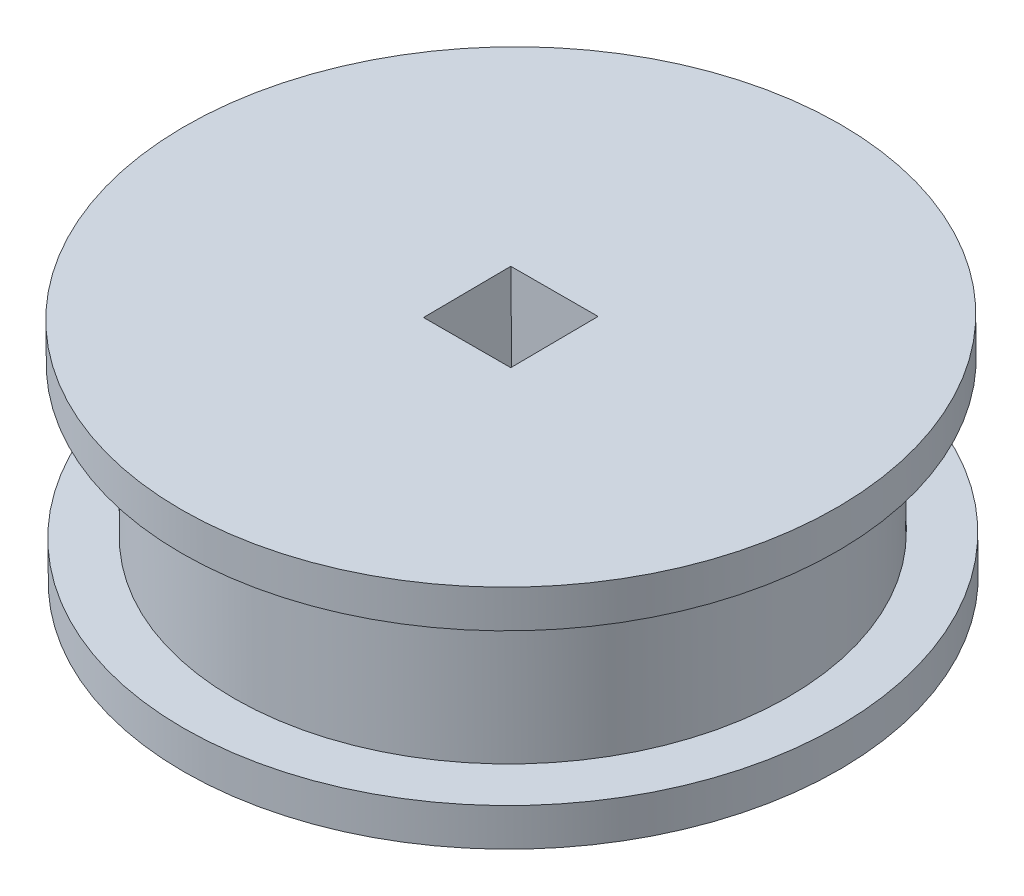
ISO-10303-21;
HEADER;
FILE_DESCRIPTION(('STEP AP214'),'2;1');
FILE_NAME('part.step','',(''),(''),'','','');
FILE_SCHEMA(('AUTOMOTIVE_DESIGN { 1 0 10303 214 1 1 1 1 }'));
ENDSEC;
DATA;
#1=APPLICATION_CONTEXT('core data for automotive mechanical design processes');
#2=APPLICATION_PROTOCOL_DEFINITION('international standard','automotive_design',2000,#1);
#3=PRODUCT_CONTEXT('',#1,'mechanical');
#4=PRODUCT('Part','Part','',(#3));
#5=PRODUCT_RELATED_PRODUCT_CATEGORY('part','',(#4));
#6=PRODUCT_DEFINITION_FORMATION('','',#4);
#7=PRODUCT_DEFINITION_CONTEXT('part definition',#1,'design');
#8=PRODUCT_DEFINITION('design','',#6,#7);
#9=PRODUCT_DEFINITION_SHAPE('','',#8);
#10=(LENGTH_UNIT() NAMED_UNIT(*) SI_UNIT(.MILLI.,.METRE.));
#11=(NAMED_UNIT(*) PLANE_ANGLE_UNIT() SI_UNIT($,.RADIAN.));
#12=(NAMED_UNIT(*) SI_UNIT($,.STERADIAN.) SOLID_ANGLE_UNIT());
#13=UNCERTAINTY_MEASURE_WITH_UNIT(LENGTH_MEASURE(1.E-05),#10,'distance_accuracy_value','');
#14=(GEOMETRIC_REPRESENTATION_CONTEXT(3) GLOBAL_UNCERTAINTY_ASSIGNED_CONTEXT((#13)) GLOBAL_UNIT_ASSIGNED_CONTEXT((#10,
#11,#12)) REPRESENTATION_CONTEXT('',''));
#15=CARTESIAN_POINT('',(0.,0.,0.));
#16=DIRECTION('',(0.,0.,1.));
#17=DIRECTION('',(1.,0.,0.));
#18=AXIS2_PLACEMENT_3D('',#15,#16,#17);
#19=CARTESIAN_POINT('',(-0.0188341703012513,8.85642782679297,-1.52504104998017));
#20=DIRECTION('',(0.00212652928721231,-0.999961923064171,-0.0084634682604122));
#21=DIRECTION('',(0.,0.00846348739691547,-0.99996418404915));
#22=AXIS2_PLACEMENT_3D('',#19,#20,#21);
#23=CYLINDRICAL_SURFACE('',#22,11.);
#24=CARTESIAN_POINT('',(-0.0188341703012513,8.85642782679297,-1.52504104998017));
#25=DIRECTION('',(-0.00212652928721231,0.999961923064171,0.00846346826041221));
#26=DIRECTION('',(0.,-0.00846348739691547,0.99996418404915));
#27=AXIS2_PLACEMENT_3D('',#24,#25,#26);
#28=CIRCLE('',#27,11.);
#29=CARTESIAN_POINT('',(-0.0188341703012513,8.7633294654269,9.47456497456048));
#30=VERTEX_POINT('',#29);
#31=EDGE_CURVE('E11',#30,#30,#28,.T.);
#32=ORIENTED_EDGE('',*,*,#31,.F.);
#33=EDGE_LOOP('',(#32));
#34=FACE_BOUND('',#33,.T.);
#35=CARTESIAN_POINT('',(-0.00607499457797741,2.85665628840794,-1.57582185954264));
#36=DIRECTION('',(-0.00212652928721231,0.999961923064171,0.00846346826041221));
#37=DIRECTION('',(0.,-0.00846348739691547,0.99996418404915));
#38=AXIS2_PLACEMENT_3D('',#35,#36,#37);
#39=CIRCLE('',#38,11.);
#40=CARTESIAN_POINT('',(-0.00607499457797741,2.76355792704187,9.42378416499801));
#41=VERTEX_POINT('',#40);
#42=EDGE_CURVE('E45',#41,#41,#39,.T.);
#43=ORIENTED_EDGE('',*,*,#42,.T.);
#44=EDGE_LOOP('',(#43));
#45=FACE_BOUND('',#44,.T.);
#46=ADVANCED_FACE('F39',(#34,#45),#23,.T.);
#47=CARTESIAN_POINT('',(-0.0188341703012513,8.85642782679297,-1.52504104998017));
#48=DIRECTION('',(-0.00212652928721231,0.999961923064171,0.00846346826041221));
#49=DIRECTION('',(0.,-0.00846348739691547,0.99996418404915));
#50=AXIS2_PLACEMENT_3D('',#47,#48,#49);
#51=PLANE('',#50);
#52=ORIENTED_EDGE('',*,*,#31,.T.);
#53=EDGE_LOOP('',(#52));
#54=FACE_BOUND('',#53,.T.);
#55=CARTESIAN_POINT('',(-0.0188341703012513,8.85642782679297,-1.52504104998017));
#56=DIRECTION('',(-0.00212652928721231,0.999961923064171,0.00846346826041221));
#57=DIRECTION('',(0.,-0.00846348739691547,0.99996418404915));
#58=AXIS2_PLACEMENT_3D('',#55,#56,#57);
#59=CIRCLE('',#58,13.);
#60=CARTESIAN_POINT('',(-0.0188341703012513,8.74640249063307,11.4744933426588));
#61=VERTEX_POINT('',#60);
#62=EDGE_CURVE('E120',#61,#61,#59,.T.);
#63=ORIENTED_EDGE('',*,*,#62,.F.);
#64=EDGE_LOOP('',(#63));
#65=FACE_BOUND('',#64,.T.);
#66=ADVANCED_FACE('F150',(#54,#65),#51,.F.);
#67=CARTESIAN_POINT('',(-0.0220239642320697,10.3563707113892,-1.51234584758955));
#68=DIRECTION('',(-0.00212652928721231,0.999961923064171,0.00846346826041221));
#69=DIRECTION('',(0.,-0.00846348739691547,0.99996418404915));
#70=AXIS2_PLACEMENT_3D('',#67,#68,#69);
#71=PLANE('',#70);
#72=DIRECTION('',(0.,-0.00846348739691562,0.99996418404915));
#73=VECTOR('',#72,1.);
#74=CARTESIAN_POINT('',(-1.74702006389329,10.3673020955108,-3.23731511137218));
#75=LINE('',#74,#73);
#76=CARTESIAN_POINT('',(-1.74702006389329,10.3673020955108,-3.23731511137218));
#77=VERTEX_POINT('',#76);
#78=CARTESIAN_POINT('',(-1.74702006389329,10.3381030639914,0.212561323597393));
#79=VERTEX_POINT('',#78);
#80=EDGE_CURVE('E89',#77,#79,#75,.T.);
#81=ORIENTED_EDGE('',*,*,#80,.F.);
#82=DIRECTION('',(-0.999997738934039,-0.00212645312354366,-1.79978538213382E-05));
#83=VECTOR('',#82,1.);
#84=CARTESIAN_POINT('',(1.70297213542915,10.374638358787,-3.23725301877649));
#85=LINE('',#84,#83);
#86=CARTESIAN_POINT('',(1.70297213542915,10.374638358787,-3.23725301877649));
#87=VERTEX_POINT('',#86);
#88=EDGE_CURVE('E92',#87,#77,#85,.T.);
#89=ORIENTED_EDGE('',*,*,#88,.F.);
#90=DIRECTION('',(0.,0.00846348739691512,-0.99996418404915));
#91=VECTOR('',#90,1.);
#92=CARTESIAN_POINT('',(1.70297213542915,10.3454393272677,0.212623416193076));
#93=LINE('',#92,#91);
#94=CARTESIAN_POINT('',(1.70297213542915,10.3454393272677,0.212623416193076));
#95=VERTEX_POINT('',#94);
#96=EDGE_CURVE('E80',#95,#87,#93,.T.);
#97=ORIENTED_EDGE('',*,*,#96,.F.);
#98=DIRECTION('',(0.999997738934039,0.00212645312354416,1.79978538213068E-05));
#99=VECTOR('',#98,1.);
#100=CARTESIAN_POINT('',(-1.74702006389329,10.3381030639914,0.212561323597393));
#101=LINE('',#100,#99);
#102=EDGE_CURVE('E88',#79,#95,#101,.T.);
#103=ORIENTED_EDGE('',*,*,#102,.F.);
#104=EDGE_LOOP('',(#81,#89,#97,#103));
#105=FACE_BOUND('',#104,.T.);
#106=CARTESIAN_POINT('',(-0.0220239642320697,10.3563707113892,-1.51234584758955));
#107=DIRECTION('',(-0.00212652928721231,0.999961923064171,0.00846346826041221));
#108=DIRECTION('',(0.,-0.00846348739691547,0.99996418404915));
#109=AXIS2_PLACEMENT_3D('',#106,#107,#108);
#110=CIRCLE('',#109,13.);
#111=CARTESIAN_POINT('',(-0.0220239642320697,10.2463453752293,11.4871885450494));
#112=VERTEX_POINT('',#111);
#113=EDGE_CURVE('E113',#112,#112,#110,.T.);
#114=ORIENTED_EDGE('',*,*,#113,.T.);
#115=EDGE_LOOP('',(#114));
#116=FACE_BOUND('',#115,.T.);
#117=ADVANCED_FACE('F95',(#105,#116),#71,.T.);
#118=CARTESIAN_POINT('',(-0.0220239642320697,10.3563707113892,-1.51234584758955));
#119=DIRECTION('',(0.00212652928721231,-0.999961923064171,-0.00846346826041221));
#120=DIRECTION('',(0.,0.00846348739691547,-0.99996418404915));
#121=AXIS2_PLACEMENT_3D('',#118,#119,#120);
#122=CYLINDRICAL_SURFACE('',#121,13.);
#123=ORIENTED_EDGE('',*,*,#113,.F.);
#124=EDGE_LOOP('',(#123));
#125=FACE_BOUND('',#124,.T.);
#126=ORIENTED_EDGE('',*,*,#62,.T.);
#127=EDGE_LOOP('',(#126));
#128=FACE_BOUND('',#127,.T.);
#129=ADVANCED_FACE('F165',(#125,#128),#122,.T.);
#130=CARTESIAN_POINT('',(-0.00607499457797744,2.85665628840795,-1.57582185954264));
#131=DIRECTION('',(0.00212652928721231,-0.999961923064171,-0.00846346826041221));
#132=DIRECTION('',(0.,-0.00846348739691548,0.99996418404915));
#133=AXIS2_PLACEMENT_3D('',#130,#131,#132);
#134=PLANE('',#133);
#135=ORIENTED_EDGE('',*,*,#42,.F.);
#136=EDGE_LOOP('',(#135));
#137=FACE_BOUND('',#136,.T.);
#138=CARTESIAN_POINT('',(-0.00607499457797744,2.85665628840795,-1.57582185954264));
#139=DIRECTION('',(-0.00212652928721231,0.999961923064171,0.00846346826041221));
#140=DIRECTION('',(0.,-0.00846348739691548,0.99996418404915));
#141=AXIS2_PLACEMENT_3D('',#138,#139,#140);
#142=CIRCLE('',#141,13.);
#143=CARTESIAN_POINT('',(-0.00607499457797744,2.74663095224805,11.4237125330963));
#144=VERTEX_POINT('',#143);
#145=EDGE_CURVE('E108',#144,#144,#142,.T.);
#146=ORIENTED_EDGE('',*,*,#145,.T.);
#147=EDGE_LOOP('',(#146));
#148=FACE_BOUND('',#147,.T.);
#149=ADVANCED_FACE('F157',(#137,#148),#134,.F.);
#150=CARTESIAN_POINT('',(-0.00288520064715897,1.3567134038117,-1.58851706193326));
#151=DIRECTION('',(0.00212652928721231,-0.999961923064171,-0.00846346826041221));
#152=DIRECTION('',(0.,-0.00846348739691548,0.99996418404915));
#153=AXIS2_PLACEMENT_3D('',#150,#151,#152);
#154=PLANE('',#153);
#155=DIRECTION('',(0.,0.00846348739691547,-0.99996418404915));
#156=VECTOR('',#155,1.);
#157=CARTESIAN_POINT('',(-1.72788130030838,1.35304527217358,-1.5885481082311));
#158=LINE('',#157,#156);
#159=CARTESIAN_POINT('',(-1.72788130030838,1.3384457564139,0.136390109253683));
#160=VERTEX_POINT('',#159);
#161=CARTESIAN_POINT('',(-1.72788130030838,1.36764478793326,-3.31348632571588));
#162=VERTEX_POINT('',#161);
#163=EDGE_CURVE('E101',#160,#162,#158,.T.);
#164=ORIENTED_EDGE('',*,*,#163,.F.);
#165=DIRECTION('',(-0.999997738934039,-0.00212645312354388,-1.79978538213044E-05));
#166=VECTOR('',#165,1.);
#167=CARTESIAN_POINT('',(-0.00288520064715865,1.34211388805202,0.136421155551524));
#168=LINE('',#167,#166);
#169=CARTESIAN_POINT('',(1.72211089901406,1.34578201969013,0.136452201849366));
#170=VERTEX_POINT('',#169);
#171=EDGE_CURVE('E102',#170,#160,#168,.T.);
#172=ORIENTED_EDGE('',*,*,#171,.F.);
#173=DIRECTION('',(0.,-0.00846348739691547,0.99996418404915));
#174=VECTOR('',#173,1.);
#175=CARTESIAN_POINT('',(1.72211089901406,1.36038153544981,-1.58848601563542));
#176=LINE('',#175,#174);
#177=CARTESIAN_POINT('',(1.72211089901406,1.37498105120949,-3.3134242331202));
#178=VERTEX_POINT('',#177);
#179=EDGE_CURVE('E85',#178,#170,#176,.T.);
#180=ORIENTED_EDGE('',*,*,#179,.F.);
#181=DIRECTION('',(0.999997738934039,0.00212645312354388,1.799785382134E-05));
#182=VECTOR('',#181,1.);
#183=CARTESIAN_POINT('',(-0.00288520064715924,1.37131291957137,-3.31345527941804));
#184=LINE('',#183,#182);
#185=EDGE_CURVE('E106',#162,#178,#184,.T.);
#186=ORIENTED_EDGE('',*,*,#185,.F.);
#187=EDGE_LOOP('',(#164,#172,#180,#186));
#188=FACE_BOUND('',#187,.T.);
#189=CARTESIAN_POINT('',(-0.00288520064715897,1.3567134038117,-1.58851706193326));
#190=DIRECTION('',(-0.00212652928721231,0.999961923064171,0.00846346826041221));
#191=DIRECTION('',(0.,-0.00846348739691548,0.99996418404915));
#192=AXIS2_PLACEMENT_3D('',#189,#190,#191);
#193=CIRCLE('',#192,13.);
#194=CARTESIAN_POINT('',(-0.00288520064715897,1.24668806765179,11.4110173307057));
#195=VERTEX_POINT('',#194);
#196=EDGE_CURVE('E109',#195,#195,#193,.T.);
#197=ORIENTED_EDGE('',*,*,#196,.F.);
#198=EDGE_LOOP('',(#197));
#199=FACE_BOUND('',#198,.T.);
#200=ADVANCED_FACE('F128',(#188,#199),#154,.T.);
#201=CARTESIAN_POINT('',(-0.00288520064715897,1.3567134038117,-1.58851706193326));
#202=DIRECTION('',(-0.00212652928721231,0.999961923064171,0.0084634682604122));
#203=DIRECTION('',(0.,-0.00846348739691547,0.99996418404915));
#204=AXIS2_PLACEMENT_3D('',#201,#202,#203);
#205=CYLINDRICAL_SURFACE('',#204,13.);
#206=ORIENTED_EDGE('',*,*,#196,.T.);
#207=EDGE_LOOP('',(#206));
#208=FACE_BOUND('',#207,.T.);
#209=ORIENTED_EDGE('',*,*,#145,.F.);
#210=EDGE_LOOP('',(#209));
#211=FACE_BOUND('',#210,.T.);
#212=ADVANCED_FACE('F131',(#208,#211),#205,.T.);
#213=CARTESIAN_POINT('',(-1.73061926030921,2.62592191024552,0.147287037739321));
#214=DIRECTION('',(-0.999997738934039,-0.00212645312354388,-1.79978538214933E-05));
#215=DIRECTION('',(0.00212645312388828,-0.999997739096,0.));
#216=AXIS2_PLACEMENT_3D('',#213,#214,#215);
#217=PLANE('',#216);
#218=DIRECTION('',(-0.00212652928721231,0.999961923064171,0.00846346826041221));
#219=VECTOR('',#218,1.);
#220=CARTESIAN_POINT('',(-1.73061926030921,2.65512094176488,-3.30258939723025));
#221=LINE('',#220,#219);
#222=EDGE_CURVE('E121',#162,#77,#221,.T.);
#223=ORIENTED_EDGE('',*,*,#222,.T.);
#224=ORIENTED_EDGE('',*,*,#80,.T.);
#225=DIRECTION('',(-0.00212652928721231,0.999961923064171,0.00846346826041221));
#226=VECTOR('',#225,1.);
#227=CARTESIAN_POINT('',(-1.73061926030921,2.62592191024552,0.147287037739321));
#228=LINE('',#227,#226);
#229=EDGE_CURVE('E53',#160,#79,#228,.T.);
#230=ORIENTED_EDGE('',*,*,#229,.F.);
#231=ORIENTED_EDGE('',*,*,#163,.T.);
#232=EDGE_LOOP('',(#223,#224,#230,#231));
#233=FACE_BOUND('',#232,.T.);
#234=ADVANCED_FACE('F132',(#233),#217,.F.);
#235=CARTESIAN_POINT('',(-1.73061926030921,2.65512094176488,-3.30258939723025));
#236=DIRECTION('',(0.,0.00846348739691547,-0.99996418404915));
#237=DIRECTION('',(0.,0.99996418404915,0.00846348739691547));
#238=AXIS2_PLACEMENT_3D('',#235,#236,#237);
#239=PLANE('',#238);
#240=DIRECTION('',(-0.00212652928721231,0.999961923064171,0.00846346826041221));
#241=VECTOR('',#240,1.);
#242=CARTESIAN_POINT('',(1.71937293901322,2.66245720504111,-3.30252730463456));
#243=LINE('',#242,#241);
#244=EDGE_CURVE('E117',#178,#87,#243,.T.);
#245=ORIENTED_EDGE('',*,*,#244,.T.);
#246=ORIENTED_EDGE('',*,*,#88,.T.);
#247=ORIENTED_EDGE('',*,*,#222,.F.);
#248=ORIENTED_EDGE('',*,*,#185,.T.);
#249=EDGE_LOOP('',(#245,#246,#247,#248));
#250=FACE_BOUND('',#249,.T.);
#251=ADVANCED_FACE('F127',(#250),#239,.F.);
#252=CARTESIAN_POINT('',(1.71937293901322,2.66245720504111,-3.30252730463456));
#253=DIRECTION('',(0.999997738934039,0.00212645312354388,1.79978538209895E-05));
#254=DIRECTION('',(-0.00212645312388829,0.999997739096,0.));
#255=AXIS2_PLACEMENT_3D('',#252,#253,#254);
#256=PLANE('',#255);
#257=DIRECTION('',(-0.00212652928721231,0.999961923064171,0.00846346826041221));
#258=VECTOR('',#257,1.);
#259=CARTESIAN_POINT('',(1.71937293901322,2.63325817352175,0.147349130335005));
#260=LINE('',#259,#258);
#261=EDGE_CURVE('E50',#170,#95,#260,.T.);
#262=ORIENTED_EDGE('',*,*,#261,.T.);
#263=ORIENTED_EDGE('',*,*,#96,.T.);
#264=ORIENTED_EDGE('',*,*,#244,.F.);
#265=ORIENTED_EDGE('',*,*,#179,.T.);
#266=EDGE_LOOP('',(#262,#263,#264,#265));
#267=FACE_BOUND('',#266,.T.);
#268=ADVANCED_FACE('F79',(#267),#256,.F.);
#269=CARTESIAN_POINT('',(-1.73061926030921,2.62592191024552,0.147287037739321));
#270=DIRECTION('',(0.,-0.00846348739691547,0.99996418404915));
#271=DIRECTION('',(0.,-0.99996418404915,-0.00846348739691547));
#272=AXIS2_PLACEMENT_3D('',#269,#270,#271);
#273=PLANE('',#272);
#274=ORIENTED_EDGE('',*,*,#229,.T.);
#275=ORIENTED_EDGE('',*,*,#102,.T.);
#276=ORIENTED_EDGE('',*,*,#261,.F.);
#277=ORIENTED_EDGE('',*,*,#171,.T.);
#278=EDGE_LOOP('',(#274,#275,#276,#277));
#279=FACE_BOUND('',#278,.T.);
#280=ADVANCED_FACE('F87',(#279),#273,.F.);
#281=CLOSED_SHELL('',(#46,#66,#117,#129,#149,#200,#212,#234,#251,#268,#280));
#282=MANIFOLD_SOLID_BREP('B2',#281);
#283=ADVANCED_BREP_SHAPE_REPRESENTATION('',(#18,#282),#14);
#284=SHAPE_DEFINITION_REPRESENTATION(#9,#283);
ENDSEC;
END-ISO-10303-21;
